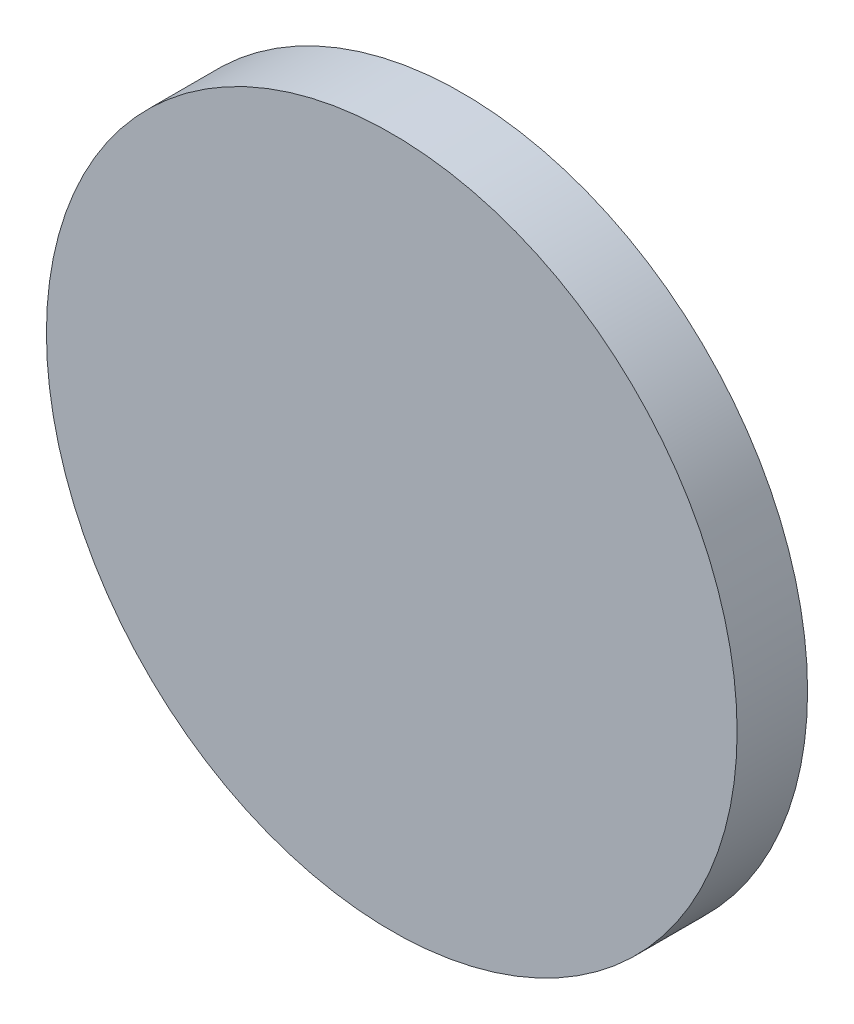
ISO-10303-21;
HEADER;
FILE_DESCRIPTION(('STEP AP214'),'2;1');
FILE_NAME('part.step','',(''),(''),'','','');
FILE_SCHEMA(('AUTOMOTIVE_DESIGN { 1 0 10303 214 1 1 1 1 }'));
ENDSEC;
DATA;
#1=APPLICATION_CONTEXT('core data for automotive mechanical design processes');
#2=APPLICATION_PROTOCOL_DEFINITION('international standard','automotive_design',2000,#1);
#3=PRODUCT_CONTEXT('',#1,'mechanical');
#4=PRODUCT('Part','Part','',(#3));
#5=PRODUCT_RELATED_PRODUCT_CATEGORY('part','',(#4));
#6=PRODUCT_DEFINITION_FORMATION('','',#4);
#7=PRODUCT_DEFINITION_CONTEXT('part definition',#1,'design');
#8=PRODUCT_DEFINITION('design','',#6,#7);
#9=PRODUCT_DEFINITION_SHAPE('','',#8);
#10=(LENGTH_UNIT() NAMED_UNIT(*) SI_UNIT(.MILLI.,.METRE.));
#11=(NAMED_UNIT(*) PLANE_ANGLE_UNIT() SI_UNIT($,.RADIAN.));
#12=(NAMED_UNIT(*) SI_UNIT($,.STERADIAN.) SOLID_ANGLE_UNIT());
#13=UNCERTAINTY_MEASURE_WITH_UNIT(LENGTH_MEASURE(1.E-05),#10,'distance_accuracy_value','');
#14=(GEOMETRIC_REPRESENTATION_CONTEXT(3) GLOBAL_UNCERTAINTY_ASSIGNED_CONTEXT((#13)) GLOBAL_UNIT_ASSIGNED_CONTEXT((#10,
#11,#12)) REPRESENTATION_CONTEXT('',''));
#15=CARTESIAN_POINT('',(0.,0.,0.));
#16=DIRECTION('',(0.,0.,1.));
#17=DIRECTION('',(1.,0.,0.));
#18=AXIS2_PLACEMENT_3D('',#15,#16,#17);
#19=CARTESIAN_POINT('',(0.,0.,29.3428015022424));
#20=DIRECTION('',(0.,0.,1.));
#21=DIRECTION('',(1.,0.,0.));
#22=AXIS2_PLACEMENT_3D('',#19,#20,#21);
#23=SPHERICAL_SURFACE('',#22,31.);
#24=CARTESIAN_POINT('',(0.,0.,0.));
#25=DIRECTION('',(0.,0.,1.));
#26=DIRECTION('',(1.,0.,0.));
#27=AXIS2_PLACEMENT_3D('',#24,#25,#26);
#28=CIRCLE('',#27,10.);
#29=CARTESIAN_POINT('',(10.,0.,0.));
#30=VERTEX_POINT('',#29);
#31=EDGE_CURVE('E10',#30,#30,#28,.T.);
#32=ORIENTED_EDGE('',*,*,#31,.F.);
#33=EDGE_LOOP('',(#32));
#34=FACE_BOUND('',#33,.T.);
#35=ADVANCED_FACE('F37',(#34),#23,.T.);
#36=CARTESIAN_POINT('',(0.,0.,2.04));
#37=DIRECTION('',(0.,0.,1.));
#38=DIRECTION('',(1.,0.,0.));
#39=AXIS2_PLACEMENT_3D('',#36,#37,#38);
#40=CYLINDRICAL_SURFACE('',#39,10.);
#41=ORIENTED_EDGE('',*,*,#31,.T.);
#42=EDGE_LOOP('',(#41));
#43=FACE_BOUND('',#42,.T.);
#44=CARTESIAN_POINT('',(0.,0.,2.04));
#45=DIRECTION('',(0.,0.,1.));
#46=DIRECTION('',(1.,0.,0.));
#47=AXIS2_PLACEMENT_3D('',#44,#45,#46);
#48=CIRCLE('',#47,10.);
#49=CARTESIAN_POINT('',(10.,0.,2.04));
#50=VERTEX_POINT('',#49);
#51=EDGE_CURVE('E43',#50,#50,#48,.T.);
#52=ORIENTED_EDGE('',*,*,#51,.F.);
#53=EDGE_LOOP('',(#52));
#54=FACE_BOUND('',#53,.T.);
#55=ADVANCED_FACE('F51',(#43,#54),#40,.T.);
#56=CARTESIAN_POINT('',(10.,0.,2.04));
#57=DIRECTION('',(0.,0.,1.));
#58=DIRECTION('',(1.,0.,0.));
#59=AXIS2_PLACEMENT_3D('',#56,#57,#58);
#60=PLANE('',#59);
#61=ORIENTED_EDGE('',*,*,#51,.T.);
#62=EDGE_LOOP('',(#61));
#63=FACE_BOUND('',#62,.T.);
#64=ADVANCED_FACE('F49',(#63),#60,.T.);
#65=CLOSED_SHELL('',(#35,#55,#64));
#66=MANIFOLD_SOLID_BREP('B2',#65);
#67=ADVANCED_BREP_SHAPE_REPRESENTATION('',(#18,#66),#14);
#68=SHAPE_DEFINITION_REPRESENTATION(#9,#67);
ENDSEC;
END-ISO-10303-21;
